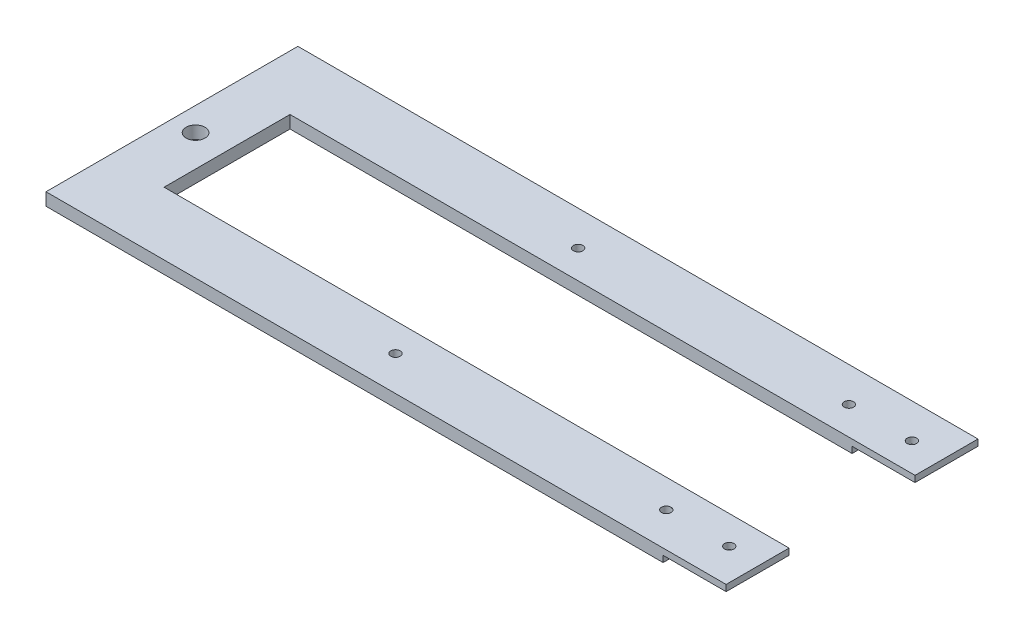
ISO-10303-21;
HEADER;
FILE_DESCRIPTION(('STEP AP214'),'2;1');
FILE_NAME('part.step','',(''),(''),'','','');
FILE_SCHEMA(('AUTOMOTIVE_DESIGN { 1 0 10303 214 1 1 1 1 }'));
ENDSEC;
DATA;
#1=APPLICATION_CONTEXT('core data for automotive mechanical design processes');
#2=APPLICATION_PROTOCOL_DEFINITION('international standard','automotive_design',2000,#1);
#3=PRODUCT_CONTEXT('',#1,'mechanical');
#4=PRODUCT('Part','Part','',(#3));
#5=PRODUCT_RELATED_PRODUCT_CATEGORY('part','',(#4));
#6=PRODUCT_DEFINITION_FORMATION('','',#4);
#7=PRODUCT_DEFINITION_CONTEXT('part definition',#1,'design');
#8=PRODUCT_DEFINITION('design','',#6,#7);
#9=PRODUCT_DEFINITION_SHAPE('','',#8);
#10=(LENGTH_UNIT() NAMED_UNIT(*) SI_UNIT(.MILLI.,.METRE.));
#11=(NAMED_UNIT(*) PLANE_ANGLE_UNIT() SI_UNIT($,.RADIAN.));
#12=(NAMED_UNIT(*) SI_UNIT($,.STERADIAN.) SOLID_ANGLE_UNIT());
#13=UNCERTAINTY_MEASURE_WITH_UNIT(LENGTH_MEASURE(1.E-05),#10,'distance_accuracy_value','');
#14=(GEOMETRIC_REPRESENTATION_CONTEXT(3) GLOBAL_UNCERTAINTY_ASSIGNED_CONTEXT((#13)) GLOBAL_UNIT_ASSIGNED_CONTEXT((#10,
#11,#12)) REPRESENTATION_CONTEXT('',''));
#15=CARTESIAN_POINT('',(0.,0.,0.));
#16=DIRECTION('',(0.,0.,1.));
#17=DIRECTION('',(1.,0.,0.));
#18=AXIS2_PLACEMENT_3D('',#15,#16,#17);
#19=CARTESIAN_POINT('',(196.,4.,0.));
#20=DIRECTION('',(-1.,0.,0.));
#21=DIRECTION('',(0.,0.,1.));
#22=AXIS2_PLACEMENT_3D('',#19,#20,#21);
#23=PLANE('',#22);
#24=DIRECTION('',(0.,0.,-1.));
#25=VECTOR('',#24,1.);
#26=CARTESIAN_POINT('',(196.,2.,20.));
#27=LINE('',#26,#25);
#28=CARTESIAN_POINT('',(196.,2.,40.));
#29=VERTEX_POINT('',#28);
#30=CARTESIAN_POINT('',(196.,2.,20.));
#31=VERTEX_POINT('',#30);
#32=EDGE_CURVE('E153',#29,#31,#27,.T.);
#33=ORIENTED_EDGE('',*,*,#32,.F.);
#34=DIRECTION('',(0.,-1.,0.));
#35=VECTOR('',#34,1.);
#36=CARTESIAN_POINT('',(196.,4.,40.));
#37=LINE('',#36,#35);
#38=CARTESIAN_POINT('',(196.,0.,40.));
#39=VERTEX_POINT('',#38);
#40=EDGE_CURVE('E255',#29,#39,#37,.T.);
#41=ORIENTED_EDGE('',*,*,#40,.T.);
#42=DIRECTION('',(0.,0.,-1.));
#43=VECTOR('',#42,1.);
#44=CARTESIAN_POINT('',(196.,0.,0.));
#45=LINE('',#44,#43);
#46=CARTESIAN_POINT('',(196.,0.,20.));
#47=VERTEX_POINT('',#46);
#48=EDGE_CURVE('E219',#39,#47,#45,.T.);
#49=ORIENTED_EDGE('',*,*,#48,.T.);
#50=DIRECTION('',(0.,-1.,0.));
#51=VECTOR('',#50,1.);
#52=CARTESIAN_POINT('',(196.,4.,20.));
#53=LINE('',#52,#51);
#54=EDGE_CURVE('E253',#31,#47,#53,.T.);
#55=ORIENTED_EDGE('',*,*,#54,.F.);
#56=EDGE_LOOP('',(#33,#41,#49,#55));
#57=FACE_BOUND('',#56,.T.);
#58=ADVANCED_FACE('F36',(#57),#23,.F.);
#59=CARTESIAN_POINT('',(196.,4.,0.));
#60=DIRECTION('',(1.,0.,0.));
#61=DIRECTION('',(0.,0.,-1.));
#62=AXIS2_PLACEMENT_3D('',#59,#60,#61);
#63=PLANE('',#62);
#64=DIRECTION('',(0.,-1.,0.));
#65=VECTOR('',#64,1.);
#66=CARTESIAN_POINT('',(196.,4.,-40.));
#67=LINE('',#66,#65);
#68=CARTESIAN_POINT('',(196.,2.,-40.));
#69=VERTEX_POINT('',#68);
#70=CARTESIAN_POINT('',(196.,0.,-40.));
#71=VERTEX_POINT('',#70);
#72=EDGE_CURVE('E58',#69,#71,#67,.T.);
#73=ORIENTED_EDGE('',*,*,#72,.F.);
#74=DIRECTION('',(0.,0.,-1.));
#75=VECTOR('',#74,1.);
#76=CARTESIAN_POINT('',(196.,2.,-20.));
#77=LINE('',#76,#75);
#78=CARTESIAN_POINT('',(196.,2.,-20.));
#79=VERTEX_POINT('',#78);
#80=EDGE_CURVE('E53',#79,#69,#77,.T.);
#81=ORIENTED_EDGE('',*,*,#80,.F.);
#82=DIRECTION('',(0.,-1.,0.));
#83=VECTOR('',#82,1.);
#84=CARTESIAN_POINT('',(196.,4.,-20.));
#85=LINE('',#84,#83);
#86=CARTESIAN_POINT('',(196.,0.,-20.));
#87=VERTEX_POINT('',#86);
#88=EDGE_CURVE('E248',#79,#87,#85,.T.);
#89=ORIENTED_EDGE('',*,*,#88,.T.);
#90=DIRECTION('',(0.,0.,1.));
#91=VECTOR('',#90,1.);
#92=CARTESIAN_POINT('',(196.,0.,0.));
#93=LINE('',#92,#91);
#94=EDGE_CURVE('E230',#71,#87,#93,.T.);
#95=ORIENTED_EDGE('',*,*,#94,.F.);
#96=EDGE_LOOP('',(#73,#81,#89,#95));
#97=FACE_BOUND('',#96,.T.);
#98=ADVANCED_FACE('F289',(#97),#63,.T.);
#99=CARTESIAN_POINT('',(0.,4.,-40.));
#100=DIRECTION('',(0.,0.,-1.));
#101=DIRECTION('',(-1.,0.,0.));
#102=AXIS2_PLACEMENT_3D('',#99,#100,#101);
#103=PLANE('',#102);
#104=DIRECTION('',(1.,0.,0.));
#105=VECTOR('',#104,1.);
#106=CARTESIAN_POINT('',(0.,0.,-40.));
#107=LINE('',#106,#105);
#108=CARTESIAN_POINT('',(0.,0.,-40.));
#109=VERTEX_POINT('',#108);
#110=EDGE_CURVE('E184',#109,#71,#107,.T.);
#111=ORIENTED_EDGE('',*,*,#110,.F.);
#112=DIRECTION('',(0.,-1.,0.));
#113=VECTOR('',#112,1.);
#114=CARTESIAN_POINT('',(0.,4.,-40.));
#115=LINE('',#114,#113);
#116=CARTESIAN_POINT('',(0.,4.,-40.));
#117=VERTEX_POINT('',#116);
#118=EDGE_CURVE('E11',#117,#109,#115,.T.);
#119=ORIENTED_EDGE('',*,*,#118,.F.);
#120=DIRECTION('',(1.,0.,0.));
#121=VECTOR('',#120,1.);
#122=CARTESIAN_POINT('',(0.,4.,-40.));
#123=LINE('',#122,#121);
#124=CARTESIAN_POINT('',(216.,4.,-40.));
#125=VERTEX_POINT('',#124);
#126=EDGE_CURVE('E185',#117,#125,#123,.T.);
#127=ORIENTED_EDGE('',*,*,#126,.T.);
#128=DIRECTION('',(0.,1.,0.));
#129=VECTOR('',#128,1.);
#130=CARTESIAN_POINT('',(216.,4.,-40.));
#131=LINE('',#130,#129);
#132=CARTESIAN_POINT('',(216.,2.,-40.));
#133=VERTEX_POINT('',#132);
#134=EDGE_CURVE('E171',#133,#125,#131,.T.);
#135=ORIENTED_EDGE('',*,*,#134,.F.);
#136=DIRECTION('',(-1.,0.,0.));
#137=VECTOR('',#136,1.);
#138=CARTESIAN_POINT('',(216.,2.,-40.));
#139=LINE('',#138,#137);
#140=EDGE_CURVE('E177',#133,#69,#139,.T.);
#141=ORIENTED_EDGE('',*,*,#140,.T.);
#142=ORIENTED_EDGE('',*,*,#72,.T.);
#143=EDGE_LOOP('',(#111,#119,#127,#135,#141,#142));
#144=FACE_BOUND('',#143,.T.);
#145=ADVANCED_FACE('F38',(#144),#103,.T.);
#146=CARTESIAN_POINT('',(0.,4.,0.));
#147=DIRECTION('',(-1.,0.,0.));
#148=DIRECTION('',(0.,0.,1.));
#149=AXIS2_PLACEMENT_3D('',#146,#147,#148);
#150=PLANE('',#149);
#151=DIRECTION('',(0.,0.,-1.));
#152=VECTOR('',#151,1.);
#153=CARTESIAN_POINT('',(0.,0.,0.));
#154=LINE('',#153,#152);
#155=CARTESIAN_POINT('',(0.,0.,40.));
#156=VERTEX_POINT('',#155);
#157=EDGE_CURVE('E213',#156,#109,#154,.T.);
#158=ORIENTED_EDGE('',*,*,#157,.F.);
#159=DIRECTION('',(0.,-1.,0.));
#160=VECTOR('',#159,1.);
#161=CARTESIAN_POINT('',(0.,4.,40.));
#162=LINE('',#161,#160);
#163=CARTESIAN_POINT('',(0.,4.,40.));
#164=VERTEX_POINT('',#163);
#165=EDGE_CURVE('E45',#164,#156,#162,.T.);
#166=ORIENTED_EDGE('',*,*,#165,.F.);
#167=DIRECTION('',(0.,0.,-1.));
#168=VECTOR('',#167,1.);
#169=CARTESIAN_POINT('',(0.,4.,0.));
#170=LINE('',#169,#168);
#171=EDGE_CURVE('E187',#164,#117,#170,.T.);
#172=ORIENTED_EDGE('',*,*,#171,.T.);
#173=ORIENTED_EDGE('',*,*,#118,.T.);
#174=EDGE_LOOP('',(#158,#166,#172,#173));
#175=FACE_BOUND('',#174,.T.);
#176=ADVANCED_FACE('F302',(#175),#150,.T.);
#177=CARTESIAN_POINT('',(0.,4.,40.));
#178=DIRECTION('',(0.,0.,-1.));
#179=DIRECTION('',(-1.,0.,0.));
#180=AXIS2_PLACEMENT_3D('',#177,#178,#179);
#181=PLANE('',#180);
#182=DIRECTION('',(1.,0.,0.));
#183=VECTOR('',#182,1.);
#184=CARTESIAN_POINT('',(0.,0.,40.));
#185=LINE('',#184,#183);
#186=EDGE_CURVE('E216',#156,#39,#185,.T.);
#187=ORIENTED_EDGE('',*,*,#186,.T.);
#188=ORIENTED_EDGE('',*,*,#40,.F.);
#189=DIRECTION('',(-1.,0.,0.));
#190=VECTOR('',#189,1.);
#191=CARTESIAN_POINT('',(216.,2.,40.));
#192=LINE('',#191,#190);
#193=CARTESIAN_POINT('',(216.,2.,40.));
#194=VERTEX_POINT('',#193);
#195=EDGE_CURVE('E164',#194,#29,#192,.T.);
#196=ORIENTED_EDGE('',*,*,#195,.F.);
#197=DIRECTION('',(0.,-1.,0.));
#198=VECTOR('',#197,1.);
#199=CARTESIAN_POINT('',(216.,4.,40.));
#200=LINE('',#199,#198);
#201=CARTESIAN_POINT('',(216.,4.,40.));
#202=VERTEX_POINT('',#201);
#203=EDGE_CURVE('E147',#202,#194,#200,.T.);
#204=ORIENTED_EDGE('',*,*,#203,.F.);
#205=DIRECTION('',(1.,0.,0.));
#206=VECTOR('',#205,1.);
#207=CARTESIAN_POINT('',(0.,4.,40.));
#208=LINE('',#207,#206);
#209=EDGE_CURVE('E136',#164,#202,#208,.T.);
#210=ORIENTED_EDGE('',*,*,#209,.F.);
#211=ORIENTED_EDGE('',*,*,#165,.T.);
#212=EDGE_LOOP('',(#187,#188,#196,#204,#210,#211));
#213=FACE_BOUND('',#212,.T.);
#214=ADVANCED_FACE('F300',(#213),#181,.F.);
#215=CARTESIAN_POINT('',(0.,4.,20.));
#216=DIRECTION('',(0.,0.,1.));
#217=DIRECTION('',(1.,0.,0.));
#218=AXIS2_PLACEMENT_3D('',#215,#216,#217);
#219=PLANE('',#218);
#220=DIRECTION('',(-1.,0.,0.));
#221=VECTOR('',#220,1.);
#222=CARTESIAN_POINT('',(0.,0.,20.));
#223=LINE('',#222,#221);
#224=CARTESIAN_POINT('',(17.5,0.,20.));
#225=VERTEX_POINT('',#224);
#226=EDGE_CURVE('E222',#47,#225,#223,.T.);
#227=ORIENTED_EDGE('',*,*,#226,.T.);
#228=DIRECTION('',(0.,-1.,0.));
#229=VECTOR('',#228,1.);
#230=CARTESIAN_POINT('',(17.5,4.,20.));
#231=LINE('',#230,#229);
#232=CARTESIAN_POINT('',(17.5,4.,20.));
#233=VERTEX_POINT('',#232);
#234=EDGE_CURVE('E131',#233,#225,#231,.T.);
#235=ORIENTED_EDGE('',*,*,#234,.F.);
#236=DIRECTION('',(-1.,0.,0.));
#237=VECTOR('',#236,1.);
#238=CARTESIAN_POINT('',(0.,4.,20.));
#239=LINE('',#238,#237);
#240=CARTESIAN_POINT('',(216.,4.,20.));
#241=VERTEX_POINT('',#240);
#242=EDGE_CURVE('E124',#241,#233,#239,.T.);
#243=ORIENTED_EDGE('',*,*,#242,.F.);
#244=DIRECTION('',(0.,1.,0.));
#245=VECTOR('',#244,1.);
#246=CARTESIAN_POINT('',(216.,4.,20.));
#247=LINE('',#246,#245);
#248=CARTESIAN_POINT('',(216.,2.,20.));
#249=VERTEX_POINT('',#248);
#250=EDGE_CURVE('E130',#249,#241,#247,.T.);
#251=ORIENTED_EDGE('',*,*,#250,.F.);
#252=DIRECTION('',(-1.,0.,0.));
#253=VECTOR('',#252,1.);
#254=CARTESIAN_POINT('',(216.,2.,20.));
#255=LINE('',#254,#253);
#256=EDGE_CURVE('E161',#249,#31,#255,.T.);
#257=ORIENTED_EDGE('',*,*,#256,.T.);
#258=ORIENTED_EDGE('',*,*,#54,.T.);
#259=EDGE_LOOP('',(#227,#235,#243,#251,#257,#258));
#260=FACE_BOUND('',#259,.T.);
#261=ADVANCED_FACE('F127',(#260),#219,.F.);
#262=CARTESIAN_POINT('',(17.5,4.,0.));
#263=DIRECTION('',(1.,0.,0.));
#264=DIRECTION('',(0.,0.,-1.));
#265=AXIS2_PLACEMENT_3D('',#262,#263,#264);
#266=PLANE('',#265);
#267=DIRECTION('',(0.,0.,1.));
#268=VECTOR('',#267,1.);
#269=CARTESIAN_POINT('',(17.5,0.,0.));
#270=LINE('',#269,#268);
#271=CARTESIAN_POINT('',(17.5,0.,-20.));
#272=VERTEX_POINT('',#271);
#273=EDGE_CURVE('E224',#272,#225,#270,.T.);
#274=ORIENTED_EDGE('',*,*,#273,.F.);
#275=DIRECTION('',(0.,-1.,0.));
#276=VECTOR('',#275,1.);
#277=CARTESIAN_POINT('',(17.5,4.,-20.));
#278=LINE('',#277,#276);
#279=CARTESIAN_POINT('',(17.5,4.,-20.));
#280=VERTEX_POINT('',#279);
#281=EDGE_CURVE('E250',#280,#272,#278,.T.);
#282=ORIENTED_EDGE('',*,*,#281,.F.);
#283=DIRECTION('',(0.,0.,1.));
#284=VECTOR('',#283,1.);
#285=CARTESIAN_POINT('',(17.5,4.,0.));
#286=LINE('',#285,#284);
#287=EDGE_CURVE('E135',#280,#233,#286,.T.);
#288=ORIENTED_EDGE('',*,*,#287,.T.);
#289=ORIENTED_EDGE('',*,*,#234,.T.);
#290=EDGE_LOOP('',(#274,#282,#288,#289));
#291=FACE_BOUND('',#290,.T.);
#292=ADVANCED_FACE('F331',(#291),#266,.T.);
#293=CARTESIAN_POINT('',(0.,4.,-20.));
#294=DIRECTION('',(0.,0.,1.));
#295=DIRECTION('',(1.,0.,0.));
#296=AXIS2_PLACEMENT_3D('',#293,#294,#295);
#297=PLANE('',#296);
#298=DIRECTION('',(-1.,0.,0.));
#299=VECTOR('',#298,1.);
#300=CARTESIAN_POINT('',(0.,0.,-20.));
#301=LINE('',#300,#299);
#302=EDGE_CURVE('E227',#87,#272,#301,.T.);
#303=ORIENTED_EDGE('',*,*,#302,.F.);
#304=ORIENTED_EDGE('',*,*,#88,.F.);
#305=DIRECTION('',(-1.,0.,0.));
#306=VECTOR('',#305,1.);
#307=CARTESIAN_POINT('',(216.,2.,-20.));
#308=LINE('',#307,#306);
#309=CARTESIAN_POINT('',(216.,2.,-20.));
#310=VERTEX_POINT('',#309);
#311=EDGE_CURVE('E181',#310,#79,#308,.T.);
#312=ORIENTED_EDGE('',*,*,#311,.F.);
#313=DIRECTION('',(0.,-1.,0.));
#314=VECTOR('',#313,1.);
#315=CARTESIAN_POINT('',(216.,4.,-20.));
#316=LINE('',#315,#314);
#317=CARTESIAN_POINT('',(216.,4.,-20.));
#318=VERTEX_POINT('',#317);
#319=EDGE_CURVE('E166',#318,#310,#316,.T.);
#320=ORIENTED_EDGE('',*,*,#319,.F.);
#321=DIRECTION('',(-1.,0.,0.));
#322=VECTOR('',#321,1.);
#323=CARTESIAN_POINT('',(0.,4.,-20.));
#324=LINE('',#323,#322);
#325=EDGE_CURVE('E193',#318,#280,#324,.T.);
#326=ORIENTED_EDGE('',*,*,#325,.T.);
#327=ORIENTED_EDGE('',*,*,#281,.T.);
#328=EDGE_LOOP('',(#303,#304,#312,#320,#326,#327));
#329=FACE_BOUND('',#328,.T.);
#330=ADVANCED_FACE('F328',(#329),#297,.T.);
#331=CARTESIAN_POINT('',(186.,4.,-29.));
#332=DIRECTION('',(0.,-1.,0.));
#333=DIRECTION('',(0.,0.,-1.));
#334=AXIS2_PLACEMENT_3D('',#331,#332,#333);
#335=CYLINDRICAL_SURFACE('',#334,1.5);
#336=CARTESIAN_POINT('',(186.,4.,-29.));
#337=DIRECTION('',(0.,1.,0.));
#338=DIRECTION('',(0.,0.,1.));
#339=AXIS2_PLACEMENT_3D('',#336,#337,#338);
#340=CIRCLE('',#339,1.5);
#341=CARTESIAN_POINT('',(186.,4.,-27.5));
#342=VERTEX_POINT('',#341);
#343=EDGE_CURVE('E205',#342,#342,#340,.T.);
#344=ORIENTED_EDGE('',*,*,#343,.T.);
#345=EDGE_LOOP('',(#344));
#346=FACE_BOUND('',#345,.T.);
#347=CARTESIAN_POINT('',(186.,0.,-29.));
#348=DIRECTION('',(0.,1.,0.));
#349=DIRECTION('',(0.,0.,1.));
#350=AXIS2_PLACEMENT_3D('',#347,#348,#349);
#351=CIRCLE('',#350,1.5);
#352=CARTESIAN_POINT('',(186.,0.,-27.5));
#353=VERTEX_POINT('',#352);
#354=EDGE_CURVE('E242',#353,#353,#351,.T.);
#355=ORIENTED_EDGE('',*,*,#354,.F.);
#356=EDGE_LOOP('',(#355));
#357=FACE_BOUND('',#356,.T.);
#358=ADVANCED_FACE('F398',(#346,#357),#335,.F.);
#359=CARTESIAN_POINT('',(100.,4.,29.));
#360=DIRECTION('',(0.,-1.,0.));
#361=DIRECTION('',(0.,0.,-1.));
#362=AXIS2_PLACEMENT_3D('',#359,#360,#361);
#363=CYLINDRICAL_SURFACE('',#362,1.5);
#364=CARTESIAN_POINT('',(100.,4.,29.));
#365=DIRECTION('',(0.,1.,0.));
#366=DIRECTION('',(0.,0.,1.));
#367=AXIS2_PLACEMENT_3D('',#364,#365,#366);
#368=CIRCLE('',#367,1.5);
#369=CARTESIAN_POINT('',(100.,4.,30.5));
#370=VERTEX_POINT('',#369);
#371=EDGE_CURVE('E202',#370,#370,#368,.F.);
#372=ORIENTED_EDGE('',*,*,#371,.F.);
#373=EDGE_LOOP('',(#372));
#374=FACE_BOUND('',#373,.T.);
#375=CARTESIAN_POINT('',(100.,0.,29.));
#376=DIRECTION('',(0.,1.,0.));
#377=DIRECTION('',(0.,0.,1.));
#378=AXIS2_PLACEMENT_3D('',#375,#376,#377);
#379=CIRCLE('',#378,1.5);
#380=CARTESIAN_POINT('',(100.,0.,30.5));
#381=VERTEX_POINT('',#380);
#382=EDGE_CURVE('E239',#381,#381,#379,.F.);
#383=ORIENTED_EDGE('',*,*,#382,.T.);
#384=EDGE_LOOP('',(#383));
#385=FACE_BOUND('',#384,.T.);
#386=ADVANCED_FACE('F468',(#374,#385),#363,.F.);
#387=CARTESIAN_POINT('',(7.5,4.,0.));
#388=DIRECTION('',(0.,-1.,0.));
#389=DIRECTION('',(0.,0.,-1.));
#390=AXIS2_PLACEMENT_3D('',#387,#388,#389);
#391=CYLINDRICAL_SURFACE('',#390,3.);
#392=CARTESIAN_POINT('',(7.5,4.,0.));
#393=DIRECTION('',(0.,1.,0.));
#394=DIRECTION('',(0.,0.,1.));
#395=AXIS2_PLACEMENT_3D('',#392,#393,#394);
#396=CIRCLE('',#395,3.);
#397=CARTESIAN_POINT('',(7.5,4.,3.));
#398=VERTEX_POINT('',#397);
#399=EDGE_CURVE('E199',#398,#398,#396,.T.);
#400=ORIENTED_EDGE('',*,*,#399,.T.);
#401=EDGE_LOOP('',(#400));
#402=FACE_BOUND('',#401,.T.);
#403=CARTESIAN_POINT('',(7.5,0.,0.));
#404=DIRECTION('',(0.,1.,0.));
#405=DIRECTION('',(0.,0.,1.));
#406=AXIS2_PLACEMENT_3D('',#403,#404,#405);
#407=CIRCLE('',#406,3.);
#408=CARTESIAN_POINT('',(7.5,0.,3.));
#409=VERTEX_POINT('',#408);
#410=EDGE_CURVE('E236',#409,#409,#407,.T.);
#411=ORIENTED_EDGE('',*,*,#410,.F.);
#412=EDGE_LOOP('',(#411));
#413=FACE_BOUND('',#412,.T.);
#414=ADVANCED_FACE('F458',(#402,#413),#391,.F.);
#415=CARTESIAN_POINT('',(186.,4.,29.));
#416=DIRECTION('',(0.,-1.,0.));
#417=DIRECTION('',(0.,0.,-1.));
#418=AXIS2_PLACEMENT_3D('',#415,#416,#417);
#419=CYLINDRICAL_SURFACE('',#418,1.5);
#420=CARTESIAN_POINT('',(186.,4.,29.));
#421=DIRECTION('',(0.,1.,0.));
#422=DIRECTION('',(0.,0.,1.));
#423=AXIS2_PLACEMENT_3D('',#420,#421,#422);
#424=CIRCLE('',#423,1.5);
#425=CARTESIAN_POINT('',(186.,4.,30.5));
#426=VERTEX_POINT('',#425);
#427=EDGE_CURVE('E196',#426,#426,#424,.F.);
#428=ORIENTED_EDGE('',*,*,#427,.F.);
#429=EDGE_LOOP('',(#428));
#430=FACE_BOUND('',#429,.T.);
#431=CARTESIAN_POINT('',(186.,0.,29.));
#432=DIRECTION('',(0.,1.,0.));
#433=DIRECTION('',(0.,0.,1.));
#434=AXIS2_PLACEMENT_3D('',#431,#432,#433);
#435=CIRCLE('',#434,1.5);
#436=CARTESIAN_POINT('',(186.,0.,30.5));
#437=VERTEX_POINT('',#436);
#438=EDGE_CURVE('E233',#437,#437,#435,.F.);
#439=ORIENTED_EDGE('',*,*,#438,.T.);
#440=EDGE_LOOP('',(#439));
#441=FACE_BOUND('',#440,.T.);
#442=ADVANCED_FACE('F284',(#430,#441),#419,.F.);
#443=CARTESIAN_POINT('',(100.,4.,-29.));
#444=DIRECTION('',(0.,-1.,0.));
#445=DIRECTION('',(0.,0.,-1.));
#446=AXIS2_PLACEMENT_3D('',#443,#444,#445);
#447=CYLINDRICAL_SURFACE('',#446,1.5);
#448=CARTESIAN_POINT('',(100.,4.,-29.));
#449=DIRECTION('',(0.,1.,0.));
#450=DIRECTION('',(0.,0.,1.));
#451=AXIS2_PLACEMENT_3D('',#448,#449,#450);
#452=CIRCLE('',#451,1.5);
#453=CARTESIAN_POINT('',(100.,4.,-27.5));
#454=VERTEX_POINT('',#453);
#455=EDGE_CURVE('E208',#454,#454,#452,.T.);
#456=ORIENTED_EDGE('',*,*,#455,.T.);
#457=EDGE_LOOP('',(#456));
#458=FACE_BOUND('',#457,.T.);
#459=CARTESIAN_POINT('',(100.,0.,-29.));
#460=DIRECTION('',(0.,1.,0.));
#461=DIRECTION('',(0.,0.,1.));
#462=AXIS2_PLACEMENT_3D('',#459,#460,#461);
#463=CIRCLE('',#462,1.5);
#464=CARTESIAN_POINT('',(100.,0.,-27.5));
#465=VERTEX_POINT('',#464);
#466=EDGE_CURVE('E188',#465,#465,#463,.T.);
#467=ORIENTED_EDGE('',*,*,#466,.F.);
#468=EDGE_LOOP('',(#467));
#469=FACE_BOUND('',#468,.T.);
#470=ADVANCED_FACE('F274',(#458,#469),#447,.F.);
#471=CARTESIAN_POINT('',(0.,4.,0.));
#472=DIRECTION('',(0.,1.,0.));
#473=DIRECTION('',(0.,0.,1.));
#474=AXIS2_PLACEMENT_3D('',#471,#472,#473);
#475=PLANE('',#474);
#476=CARTESIAN_POINT('',(206.,4.,-29.));
#477=DIRECTION('',(0.,1.,0.));
#478=DIRECTION('',(0.,0.,-1.));
#479=AXIS2_PLACEMENT_3D('',#476,#477,#478);
#480=CIRCLE('',#479,1.5);
#481=CARTESIAN_POINT('',(206.,4.,-30.5));
#482=VERTEX_POINT('',#481);
#483=EDGE_CURVE('E157',#482,#482,#480,.T.);
#484=ORIENTED_EDGE('',*,*,#483,.F.);
#485=EDGE_LOOP('',(#484));
#486=FACE_BOUND('',#485,.T.);
#487=CARTESIAN_POINT('',(206.,4.,29.));
#488=DIRECTION('',(0.,1.,0.));
#489=DIRECTION('',(0.,0.,-1.));
#490=AXIS2_PLACEMENT_3D('',#487,#488,#489);
#491=CIRCLE('',#490,1.5);
#492=CARTESIAN_POINT('',(206.,4.,27.5));
#493=VERTEX_POINT('',#492);
#494=EDGE_CURVE('E263',#493,#493,#491,.T.);
#495=ORIENTED_EDGE('',*,*,#494,.F.);
#496=EDGE_LOOP('',(#495));
#497=FACE_BOUND('',#496,.T.);
#498=ORIENTED_EDGE('',*,*,#126,.F.);
#499=ORIENTED_EDGE('',*,*,#171,.F.);
#500=ORIENTED_EDGE('',*,*,#209,.T.);
#501=DIRECTION('',(0.,0.,1.));
#502=VECTOR('',#501,1.);
#503=CARTESIAN_POINT('',(216.,4.,20.));
#504=LINE('',#503,#502);
#505=EDGE_CURVE('E139',#241,#202,#504,.T.);
#506=ORIENTED_EDGE('',*,*,#505,.F.);
#507=ORIENTED_EDGE('',*,*,#242,.T.);
#508=ORIENTED_EDGE('',*,*,#287,.F.);
#509=ORIENTED_EDGE('',*,*,#325,.F.);
#510=DIRECTION('',(0.,0.,1.));
#511=VECTOR('',#510,1.);
#512=CARTESIAN_POINT('',(216.,4.,-20.));
#513=LINE('',#512,#511);
#514=EDGE_CURVE('E174',#125,#318,#513,.T.);
#515=ORIENTED_EDGE('',*,*,#514,.F.);
#516=EDGE_LOOP('',(#498,#499,#500,#506,#507,#508,#509,#515));
#517=FACE_BOUND('',#516,.T.);
#518=ORIENTED_EDGE('',*,*,#427,.T.);
#519=EDGE_LOOP('',(#518));
#520=FACE_BOUND('',#519,.T.);
#521=ORIENTED_EDGE('',*,*,#399,.F.);
#522=EDGE_LOOP('',(#521));
#523=FACE_BOUND('',#522,.T.);
#524=ORIENTED_EDGE('',*,*,#371,.T.);
#525=EDGE_LOOP('',(#524));
#526=FACE_BOUND('',#525,.T.);
#527=ORIENTED_EDGE('',*,*,#343,.F.);
#528=EDGE_LOOP('',(#527));
#529=FACE_BOUND('',#528,.T.);
#530=ORIENTED_EDGE('',*,*,#455,.F.);
#531=EDGE_LOOP('',(#530));
#532=FACE_BOUND('',#531,.T.);
#533=ADVANCED_FACE('F141',(#486,#497,#517,#520,#523,#526,#529,#532),#475,.T.);
#534=CARTESIAN_POINT('',(0.,0.,0.));
#535=DIRECTION('',(0.,1.,0.));
#536=DIRECTION('',(0.,0.,1.));
#537=AXIS2_PLACEMENT_3D('',#534,#535,#536);
#538=PLANE('',#537);
#539=ORIENTED_EDGE('',*,*,#110,.T.);
#540=ORIENTED_EDGE('',*,*,#94,.T.);
#541=ORIENTED_EDGE('',*,*,#302,.T.);
#542=ORIENTED_EDGE('',*,*,#273,.T.);
#543=ORIENTED_EDGE('',*,*,#226,.F.);
#544=ORIENTED_EDGE('',*,*,#48,.F.);
#545=ORIENTED_EDGE('',*,*,#186,.F.);
#546=ORIENTED_EDGE('',*,*,#157,.T.);
#547=EDGE_LOOP('',(#539,#540,#541,#542,#543,#544,#545,#546));
#548=FACE_BOUND('',#547,.T.);
#549=ORIENTED_EDGE('',*,*,#438,.F.);
#550=EDGE_LOOP('',(#549));
#551=FACE_BOUND('',#550,.T.);
#552=ORIENTED_EDGE('',*,*,#410,.T.);
#553=EDGE_LOOP('',(#552));
#554=FACE_BOUND('',#553,.T.);
#555=ORIENTED_EDGE('',*,*,#382,.F.);
#556=EDGE_LOOP('',(#555));
#557=FACE_BOUND('',#556,.T.);
#558=ORIENTED_EDGE('',*,*,#354,.T.);
#559=EDGE_LOOP('',(#558));
#560=FACE_BOUND('',#559,.T.);
#561=ORIENTED_EDGE('',*,*,#466,.T.);
#562=EDGE_LOOP('',(#561));
#563=FACE_BOUND('',#562,.T.);
#564=ADVANCED_FACE('F273',(#548,#551,#554,#557,#560,#563),#538,.F.);
#565=CARTESIAN_POINT('',(216.,2.,-20.));
#566=DIRECTION('',(0.,1.,0.));
#567=DIRECTION('',(0.,0.,1.));
#568=AXIS2_PLACEMENT_3D('',#565,#566,#567);
#569=PLANE('',#568);
#570=CARTESIAN_POINT('',(206.,2.,-29.));
#571=DIRECTION('',(0.,1.,0.));
#572=DIRECTION('',(0.,0.,1.));
#573=AXIS2_PLACEMENT_3D('',#570,#571,#572);
#574=CIRCLE('',#573,1.5);
#575=CARTESIAN_POINT('',(206.,2.,-27.5));
#576=VERTEX_POINT('',#575);
#577=EDGE_CURVE('E40',#576,#576,#574,.T.);
#578=ORIENTED_EDGE('',*,*,#577,.T.);
#579=EDGE_LOOP('',(#578));
#580=FACE_BOUND('',#579,.T.);
#581=ORIENTED_EDGE('',*,*,#80,.T.);
#582=ORIENTED_EDGE('',*,*,#140,.F.);
#583=DIRECTION('',(0.,0.,-1.));
#584=VECTOR('',#583,1.);
#585=CARTESIAN_POINT('',(216.,2.,-20.));
#586=LINE('',#585,#584);
#587=EDGE_CURVE('E169',#310,#133,#586,.T.);
#588=ORIENTED_EDGE('',*,*,#587,.F.);
#589=ORIENTED_EDGE('',*,*,#311,.T.);
#590=EDGE_LOOP('',(#581,#582,#588,#589));
#591=FACE_BOUND('',#590,.T.);
#592=ADVANCED_FACE('F281',(#580,#591),#569,.F.);
#593=CARTESIAN_POINT('',(216.,0.,0.));
#594=DIRECTION('',(1.,0.,0.));
#595=DIRECTION('',(0.,0.,-1.));
#596=AXIS2_PLACEMENT_3D('',#593,#594,#595);
#597=PLANE('',#596);
#598=ORIENTED_EDGE('',*,*,#319,.T.);
#599=ORIENTED_EDGE('',*,*,#587,.T.);
#600=ORIENTED_EDGE('',*,*,#134,.T.);
#601=ORIENTED_EDGE('',*,*,#514,.T.);
#602=EDGE_LOOP('',(#598,#599,#600,#601));
#603=FACE_BOUND('',#602,.T.);
#604=ADVANCED_FACE('F321',(#603),#597,.T.);
#605=CARTESIAN_POINT('',(216.,2.,20.));
#606=DIRECTION('',(0.,1.,0.));
#607=DIRECTION('',(0.,0.,1.));
#608=AXIS2_PLACEMENT_3D('',#605,#606,#607);
#609=PLANE('',#608);
#610=CARTESIAN_POINT('',(206.,2.,29.));
#611=DIRECTION('',(0.,1.,0.));
#612=DIRECTION('',(0.,0.,1.));
#613=AXIS2_PLACEMENT_3D('',#610,#611,#612);
#614=CIRCLE('',#613,1.5);
#615=CARTESIAN_POINT('',(206.,2.,30.5));
#616=VERTEX_POINT('',#615);
#617=EDGE_CURVE('E257',#616,#616,#614,.T.);
#618=ORIENTED_EDGE('',*,*,#617,.T.);
#619=EDGE_LOOP('',(#618));
#620=FACE_BOUND('',#619,.T.);
#621=ORIENTED_EDGE('',*,*,#32,.T.);
#622=ORIENTED_EDGE('',*,*,#256,.F.);
#623=DIRECTION('',(0.,0.,-1.));
#624=VECTOR('',#623,1.);
#625=CARTESIAN_POINT('',(216.,2.,20.));
#626=LINE('',#625,#624);
#627=EDGE_CURVE('E151',#194,#249,#626,.T.);
#628=ORIENTED_EDGE('',*,*,#627,.F.);
#629=ORIENTED_EDGE('',*,*,#195,.T.);
#630=EDGE_LOOP('',(#621,#622,#628,#629));
#631=FACE_BOUND('',#630,.T.);
#632=ADVANCED_FACE('F334',(#620,#631),#609,.F.);
#633=CARTESIAN_POINT('',(216.,0.,0.));
#634=DIRECTION('',(-1.,0.,0.));
#635=DIRECTION('',(0.,0.,1.));
#636=AXIS2_PLACEMENT_3D('',#633,#634,#635);
#637=PLANE('',#636);
#638=ORIENTED_EDGE('',*,*,#250,.T.);
#639=ORIENTED_EDGE('',*,*,#505,.T.);
#640=ORIENTED_EDGE('',*,*,#203,.T.);
#641=ORIENTED_EDGE('',*,*,#627,.T.);
#642=EDGE_LOOP('',(#638,#639,#640,#641));
#643=FACE_BOUND('',#642,.T.);
#644=ADVANCED_FACE('F149',(#643),#637,.F.);
#645=CARTESIAN_POINT('',(206.,-6.,29.));
#646=DIRECTION('',(0.,1.,0.));
#647=DIRECTION('',(0.,0.,1.));
#648=AXIS2_PLACEMENT_3D('',#645,#646,#647);
#649=CYLINDRICAL_SURFACE('',#648,1.5);
#650=ORIENTED_EDGE('',*,*,#494,.T.);
#651=EDGE_LOOP('',(#650));
#652=FACE_BOUND('',#651,.T.);
#653=ORIENTED_EDGE('',*,*,#617,.F.);
#654=EDGE_LOOP('',(#653));
#655=FACE_BOUND('',#654,.T.);
#656=ADVANCED_FACE('F269',(#652,#655),#649,.F.);
#657=CARTESIAN_POINT('',(206.,-6.,-29.));
#658=DIRECTION('',(0.,1.,0.));
#659=DIRECTION('',(0.,0.,1.));
#660=AXIS2_PLACEMENT_3D('',#657,#658,#659);
#661=CYLINDRICAL_SURFACE('',#660,1.5);
#662=ORIENTED_EDGE('',*,*,#483,.T.);
#663=EDGE_LOOP('',(#662));
#664=FACE_BOUND('',#663,.T.);
#665=ORIENTED_EDGE('',*,*,#577,.F.);
#666=EDGE_LOOP('',(#665));
#667=FACE_BOUND('',#666,.T.);
#668=ADVANCED_FACE('F350',(#664,#667),#661,.F.);
#669=CLOSED_SHELL('',(#58,#98,#145,#176,#214,#261,#292,#330,#358,#386,#414,#442,#470,#533,#564,
#592,#604,#632,#644,#656,#668));
#670=MANIFOLD_SOLID_BREP('B2',#669);
#671=ADVANCED_BREP_SHAPE_REPRESENTATION('',(#18,#670),#14);
#672=SHAPE_DEFINITION_REPRESENTATION(#9,#671);
ENDSEC;
END-ISO-10303-21;
